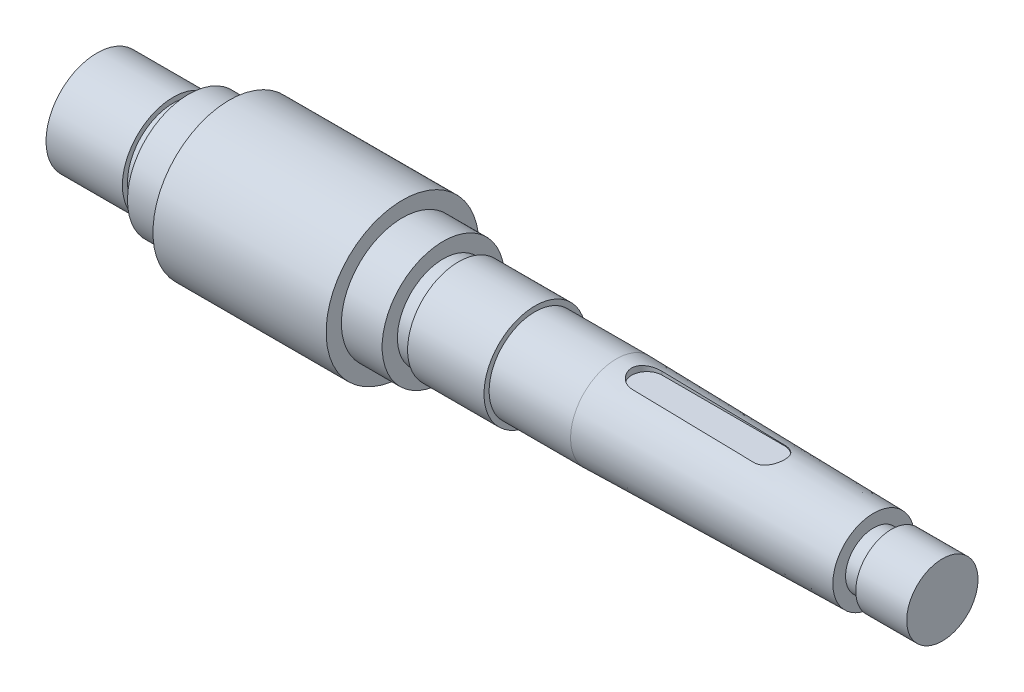
ISO-10303-21;
HEADER;
FILE_DESCRIPTION(('STEP AP214'),'2;1');
FILE_NAME('part.step','',(''),(''),'','','');
FILE_SCHEMA(('AUTOMOTIVE_DESIGN { 1 0 10303 214 1 1 1 1 }'));
ENDSEC;
DATA;
#1=APPLICATION_CONTEXT('core data for automotive mechanical design processes');
#2=APPLICATION_PROTOCOL_DEFINITION('international standard','automotive_design',2000,#1);
#3=PRODUCT_CONTEXT('',#1,'mechanical');
#4=PRODUCT('Part','Part','',(#3));
#5=PRODUCT_RELATED_PRODUCT_CATEGORY('part','',(#4));
#6=PRODUCT_DEFINITION_FORMATION('','',#4);
#7=PRODUCT_DEFINITION_CONTEXT('part definition',#1,'design');
#8=PRODUCT_DEFINITION('design','',#6,#7);
#9=PRODUCT_DEFINITION_SHAPE('','',#8);
#10=(LENGTH_UNIT() NAMED_UNIT(*) SI_UNIT(.MILLI.,.METRE.));
#11=(NAMED_UNIT(*) PLANE_ANGLE_UNIT() SI_UNIT($,.RADIAN.));
#12=(NAMED_UNIT(*) SI_UNIT($,.STERADIAN.) SOLID_ANGLE_UNIT());
#13=UNCERTAINTY_MEASURE_WITH_UNIT(LENGTH_MEASURE(1.E-05),#10,'distance_accuracy_value','');
#14=(GEOMETRIC_REPRESENTATION_CONTEXT(3) GLOBAL_UNCERTAINTY_ASSIGNED_CONTEXT((#13)) GLOBAL_UNIT_ASSIGNED_CONTEXT((#10,
#11,#12)) REPRESENTATION_CONTEXT('',''));
#15=CARTESIAN_POINT('',(0.,0.,0.));
#16=DIRECTION('',(0.,0.,1.));
#17=DIRECTION('',(1.,0.,0.));
#18=AXIS2_PLACEMENT_3D('',#15,#16,#17);
#19=CARTESIAN_POINT('',(126.5,0.,0.));
#20=DIRECTION('',(-1.,0.,0.));
#21=DIRECTION('',(0.,0.,1.));
#22=AXIS2_PLACEMENT_3D('',#19,#20,#21);
#23=CONICAL_SURFACE('',#22,8.,0.0197993925663929);
#24=CARTESIAN_POINT('',(126.5,0.,0.));
#25=DIRECTION('',(-1.,0.,0.));
#26=DIRECTION('',(0.,0.,1.));
#27=AXIS2_PLACEMENT_3D('',#24,#25,#26);
#28=CIRCLE('',#27,8.);
#29=CARTESIAN_POINT('',(126.5,0.,8.));
#30=VERTEX_POINT('',#29);
#31=EDGE_CURVE('E122',#30,#30,#28,.T.);
#32=ORIENTED_EDGE('',*,*,#31,.T.);
#33=EDGE_LOOP('',(#32));
#34=FACE_BOUND('',#33,.T.);
#35=CARTESIAN_POINT('',(76.,0.,0.));
#36=DIRECTION('',(-1.,0.,0.));
#37=DIRECTION('',(0.,0.,1.));
#38=AXIS2_PLACEMENT_3D('',#35,#36,#37);
#39=CIRCLE('',#38,9.);
#40=CARTESIAN_POINT('',(76.,0.,9.));
#41=VERTEX_POINT('',#40);
#42=EDGE_CURVE('E274',#41,#41,#39,.F.);
#43=ORIENTED_EDGE('',*,*,#42,.T.);
#44=EDGE_LOOP('',(#43));
#45=FACE_BOUND('',#44,.T.);
#46=CARTESIAN_POINT('',(67.7015994342157,8.65937921413413,3.));
#47=CARTESIAN_POINT('',(73.4673603703516,8.5385461918654,3.));
#48=CARTESIAN_POINT('',(79.2331157162742,8.41744616881826,3.));
#49=CARTESIAN_POINT('',(90.7646134080573,8.17462874625763,3.));
#50=CARTESIAN_POINT('',(96.5303557539178,8.05291134674398,3.));
#51=CARTESIAN_POINT('',(109.523755243157,7.77782492921634,3.));
#52=CARTESIAN_POINT('',(116.751408151723,7.62425570670148,3.));
#53=CARTESIAN_POINT('',(131.206685618363,7.31578576733722,3.));
#54=CARTESIAN_POINT('',(138.434310176438,7.16088505047489,3.));
#55=CARTESIAN_POINT('',(145.661917960017,7.00520342091647,3.));
#56=B_SPLINE_CURVE_WITH_KNOTS('',3,(#46,#47,#48,#49,#50,#51,#52,#53,#54,#55),.UNSPECIFIED.,.F.,
.F.,(4,2,2,2,4),(0.,17.3010808365711,34.602161677497,56.2900141665268,77.9778668659613),.UNSPECIFIED.);
#57=CARTESIAN_POINT('',(106.,7.85237780999207,3.));
#58=VERTEX_POINT('',#57);
#59=CARTESIAN_POINT('',(82.,8.35915679968532,3.));
#60=VERTEX_POINT('',#59);
#61=EDGE_CURVE('E54',#58,#60,#56,.F.);
#62=ORIENTED_EDGE('',*,*,#61,.T.);
#63=CARTESIAN_POINT('',(82.0002,8.35915259435408,2.99999999333333));
#64=CARTESIAN_POINT('',(81.9180010629251,8.36086666333517,3.00001626002523));
#65=CARTESIAN_POINT('',(81.8358367404009,8.36381871736624,2.99663288867854));
#66=CARTESIAN_POINT('',(81.6722030883547,8.37207695146977,2.98316436549772));
#67=CARTESIAN_POINT('',(81.5907335511899,8.37738240114728,2.97308129248595));
#68=CARTESIAN_POINT('',(81.4293121492684,8.39020704092438,2.94635192544998));
#69=CARTESIAN_POINT('',(81.3493563870221,8.39771937141306,2.92972591513926));
#70=CARTESIAN_POINT('',(81.191281307853,8.41475179480953,2.89009037605425));
#71=CARTESIAN_POINT('',(81.1131620796423,8.42427198448433,2.86708053960012));
#72=CARTESIAN_POINT('',(80.8824684104723,8.45546074167463,2.78880318812162));
#73=CARTESIAN_POINT('',(80.7332886214052,8.47978016498203,2.72424261178066));
#74=CARTESIAN_POINT('',(80.4478987202368,8.53297249706694,2.57238794763039));
#75=CARTESIAN_POINT('',(80.3116976120757,8.56184853062664,2.48507823221186));
#76=CARTESIAN_POINT('',(80.0502658066145,8.62249611221642,2.28616139442007));
#77=CARTESIAN_POINT('',(79.9256686423581,8.65433662078093,2.17374066654515));
#78=CARTESIAN_POINT('',(79.6967483932147,8.71667984176844,1.92952235130325));
#79=CARTESIAN_POINT('',(79.5924283402526,8.74718235360096,1.7977218713556));
#80=CARTESIAN_POINT('',(79.4047338163963,8.80444161091958,1.51462288571276));
#81=CARTESIAN_POINT('',(79.3218984348984,8.83109563674148,1.36294452418663));
#82=CARTESIAN_POINT('',(79.1832153293997,8.87689857584649,1.04666649723272));
#83=CARTESIAN_POINT('',(79.1273579822462,8.8960501648121,0.882071463614135));
#84=CARTESIAN_POINT('',(79.0465275927015,8.92408921356873,0.551958968165435));
#85=CARTESIAN_POINT('',(79.0203607509306,8.93337239417663,0.386767892667271));
#86=CARTESIAN_POINT('',(78.9958576750921,8.94205893598304,0.0540927250454134));
#87=CARTESIAN_POINT('',(78.9975140934187,8.9414649055698,-0.113390750024841));
#88=CARTESIAN_POINT('',(79.027894485599,8.93071000342325,-0.438249758829045));
#89=CARTESIAN_POINT('',(79.0554513137716,8.92096166717351,-0.595750228975074));
#90=CARTESIAN_POINT('',(79.1349382455924,8.89346082814856,-0.903725188969466));
#91=CARTESIAN_POINT('',(79.1868698212431,8.87570784197136,-1.05419925388643));
#92=CARTESIAN_POINT('',(79.3143404189009,8.83357603670031,-1.3464916888371));
#93=CARTESIAN_POINT('',(79.3902212556822,8.8091019937472,-1.48814673237288));
#94=CARTESIAN_POINT('',(79.5631174109765,8.75594607453424,-1.75703575826674));
#95=CARTESIAN_POINT('',(79.6601387465981,8.72726300104079,-1.88426561915445));
#96=CARTESIAN_POINT('',(79.8785370235662,8.66674650554063,-2.12779811043173));
#97=CARTESIAN_POINT('',(80.000927994942,8.63482672186687,-2.24317161457318));
#98=CARTESIAN_POINT('',(80.2634853029622,8.57243706386973,-2.45208045712654));
#99=CARTESIAN_POINT('',(80.4036586007138,8.54196776381447,-2.54560720240043));
#100=CARTESIAN_POINT('',(80.7016413480997,8.48509558879324,-2.70993474337041));
#101=CARTESIAN_POINT('',(80.8597583016305,8.45879107373031,-2.78021940244894));
#102=CARTESIAN_POINT('',(81.1046795261207,8.42530322652891,-2.86459142938878));
#103=CARTESIAN_POINT('',(81.1875929686086,8.41513691613645,-2.88920336612363));
#104=CARTESIAN_POINT('',(81.3554576322465,8.39707441275539,-2.93121744864749));
#105=CARTESIAN_POINT('',(81.4404078853518,8.38917716363521,-2.94862295033128));
#106=CARTESIAN_POINT('',(81.6043310777109,8.37646700294274,-2.97484998648597));
#107=CARTESIAN_POINT('',(81.6831916401469,8.37144762063953,-2.98427979932584));
#108=CARTESIAN_POINT('',(81.8414235558383,8.36362045360017,-2.99685799089608));
#109=CARTESIAN_POINT('',(81.9207941722847,8.36080998986454,-3.00001398570819));
#110=CARTESIAN_POINT('',(82.0002,8.35915259435408,-2.99999999333333));
#111=B_SPLINE_CURVE_WITH_KNOTS('',3,(#63,#64,#65,#66,#67,#68,#69,#70,#71,#72,#73,#74,#75,#76,
#77,#78,#79,#80,#81,#82,#83,#84,#85,#86,#87,#88,#89,#90,#91,#92,#93,#94,#95,#96,#97,#98,#99,
#100,#101,#102,#103,#104,#105,#106,#107,#108,#109,#110),.UNSPECIFIED.,.F.,.F.,(4,2,2,2,2,2,2,2,
2,2,2,2,2,2,2,2,2,2,2,2,2,2,2,4),(0.,0.246556907549839,0.493037347693312,0.73875961988586,
0.984493737157209,1.47515005252423,1.96614431889542,2.47625381254831,2.98643952149451,
3.5084022076923,4.03017857033914,4.53013608951832,5.02996158128682,5.50829130580088,
5.98664992058839,6.47217063140059,6.9578297143428,7.46908117468059,7.98053339176836,
8.5026809289621,8.76364687679708,9.02449116087437,9.26295933830211,9.50113785082011),.UNSPECIFIED.);
#112=CARTESIAN_POINT('',(82.,8.35915679968532,-3.));
#113=VERTEX_POINT('',#112);
#114=EDGE_CURVE('E12',#60,#113,#111,.T.);
#115=ORIENTED_EDGE('',*,*,#114,.T.);
#116=CARTESIAN_POINT('',(67.7015994342157,8.65937921413413,-3.));
#117=CARTESIAN_POINT('',(73.4673603703516,8.5385461918654,-3.));
#118=CARTESIAN_POINT('',(79.2331157162742,8.41744616881826,-3.));
#119=CARTESIAN_POINT('',(90.7646134080573,8.17462874625763,-3.));
#120=CARTESIAN_POINT('',(96.5303557539178,8.05291134674398,-3.));
#121=CARTESIAN_POINT('',(109.523755243157,7.77782492921634,-3.));
#122=CARTESIAN_POINT('',(116.751408151723,7.62425570670148,-3.));
#123=CARTESIAN_POINT('',(131.206685618363,7.31578576733722,-3.));
#124=CARTESIAN_POINT('',(138.434310176438,7.16088505047489,-3.));
#125=CARTESIAN_POINT('',(145.661917960017,7.00520342091647,-3.));
#126=B_SPLINE_CURVE_WITH_KNOTS('',3,(#116,#117,#118,#119,#120,#121,#122,#123,#124,#125),
.UNSPECIFIED.,.F.,.F.,(4,2,2,2,4),(0.,17.3010808365711,34.602161677497,56.2900141665268,
77.9778668659613),.UNSPECIFIED.);
#127=CARTESIAN_POINT('',(106.,7.85237780999207,-3.));
#128=VERTEX_POINT('',#127);
#129=EDGE_CURVE('E150',#113,#128,#126,.T.);
#130=ORIENTED_EDGE('',*,*,#129,.T.);
#131=CARTESIAN_POINT('',(105.9998,7.85238205212782,-2.99999999333333));
#132=CARTESIAN_POINT('',(106.080844146873,7.85064785022641,-3.00001660104172));
#133=CARTESIAN_POINT('',(106.161909396734,7.85019579935484,-2.99672695393381));
#134=CARTESIAN_POINT('',(106.323463607475,7.85177410222988,-2.98360857649804));
#135=CARTESIAN_POINT('',(106.403952716649,7.85380379225642,-2.97378159484397));
#136=CARTESIAN_POINT('',(106.563524847043,7.86025252300705,-2.94770362577046));
#137=CARTESIAN_POINT('',(106.642611538608,7.86466391031188,-2.93147325991976));
#138=CARTESIAN_POINT('',(106.799059532107,7.87568838346791,-2.89275068189856));
#139=CARTESIAN_POINT('',(106.876420778343,7.88230154028424,-2.87025826790008));
#140=CARTESIAN_POINT('',(107.105028938264,7.9051018796172,-2.79368386651549));
#141=CARTESIAN_POINT('',(107.25303469297,7.92426049597083,-2.73046595645925));
#142=CARTESIAN_POINT('',(107.536428375622,7.96807199890946,-2.58168011398751));
#143=CARTESIAN_POINT('',(107.671807807783,7.99272854755854,-2.49609727817249));
#144=CARTESIAN_POINT('',(107.931752174663,8.04568632721351,-2.30123424408922));
#145=CARTESIAN_POINT('',(108.055721705055,8.07408951627425,-2.19118617146046));
#146=CARTESIAN_POINT('',(108.283948040749,8.13054071811956,-1.95215384652748));
#147=CARTESIAN_POINT('',(108.388200575241,8.15858865272933,-1.82316550237987));
#148=CARTESIAN_POINT('',(108.577507519729,8.21214777698072,-1.54458951298554));
#149=CARTESIAN_POINT('',(108.661786426086,8.23753991318065,-1.39444959025394));
#150=CARTESIAN_POINT('',(108.803686113936,8.28164430900581,-1.08115335174848));
#151=CARTESIAN_POINT('',(108.861314846009,8.30035856047177,-0.918000935060528));
#152=CARTESIAN_POINT('',(108.946347728845,8.32837190806333,-0.589012099729737));
#153=CARTESIAN_POINT('',(108.974689487891,8.33796223929242,-0.423443432946697));
#154=CARTESIAN_POINT('',(109.003332527059,8.3476555255758,-0.089638234500673));
#155=CARTESIAN_POINT('',(109.0036410148,8.34776091929756,0.0785976002819341));
#156=CARTESIAN_POINT('',(108.97680731394,8.33867816449307,0.405433460157598));
#157=CARTESIAN_POINT('',(108.950819590056,8.32988086317673,0.564141079203442));
#158=CARTESIAN_POINT('',(108.874082554571,8.30453584250817,0.874787343741922));
#159=CARTESIAN_POINT('',(108.823331958614,8.28798772115194,1.02672563768908));
#160=CARTESIAN_POINT('',(108.697952720223,8.24862986934125,1.32176740948554));
#161=CARTESIAN_POINT('',(108.623035338078,8.22574492158511,1.46473771980447));
#162=CARTESIAN_POINT('',(108.451669625417,8.17618339240896,1.73641356445423));
#163=CARTESIAN_POINT('',(108.355214862909,8.14950567917193,1.86511482021049));
#164=CARTESIAN_POINT('',(108.137941029563,8.09377208965644,2.11126674894156));
#165=CARTESIAN_POINT('',(108.016160829351,8.06466371877731,2.22785894451191));
#166=CARTESIAN_POINT('',(107.754493885874,8.0086742942257,2.43927754755538));
#167=CARTESIAN_POINT('',(107.61460196777,7.98179388073423,2.5340977128159));
#168=CARTESIAN_POINT('',(107.318006071985,7.93330367666108,2.70038538943547));
#169=CARTESIAN_POINT('',(107.161101099851,7.91176972095118,2.77152129889273));
#170=CARTESIAN_POINT('',(106.917996140474,7.88610982550841,2.8573935785132));
#171=CARTESIAN_POINT('',(106.835683497861,7.8786640177383,2.88254341588021));
#172=CARTESIAN_POINT('',(106.669036090284,7.86625738377181,2.92571096669212));
#173=CARTESIAN_POINT('',(106.584702236768,7.86129545878833,2.94373183301538));
#174=CARTESIAN_POINT('',(106.417162603295,7.85418767769394,2.9720329714948));
#175=CARTESIAN_POINT('',(106.333995407583,7.85196407817039,2.9825232283794));
#176=CARTESIAN_POINT('',(106.167144803861,7.85016703530132,2.99651168149969));
#177=CARTESIAN_POINT('',(106.08346210764,7.85059051676274,3.00001798495773));
#178=CARTESIAN_POINT('',(105.9998,7.85238205212782,2.99999999333333));
#179=B_SPLINE_CURVE_WITH_KNOTS('',3,(#131,#132,#133,#134,#135,#136,#137,#138,#139,#140,#141,
#142,#143,#144,#145,#146,#147,#148,#149,#150,#151,#152,#153,#154,#155,#156,#157,#158,#159,#160,
#161,#162,#163,#164,#165,#166,#167,#168,#169,#170,#171,#172,#173,#174,#175,#176,#177,#178),
.UNSPECIFIED.,.F.,.F.,(4,2,2,2,2,2,2,2,2,2,2,2,2,2,2,2,2,2,2,2,2,2,2,4),(0.,0.243100269928748,
0.486135539018406,0.728394439447624,0.970661148869025,1.45449005453391,1.9386421968898,
2.4409381130939,2.94334270506123,3.46287206893238,3.98224634081033,4.48442316356891,
4.98647087152969,5.46739448965398,5.94834305412399,6.43526506308989,6.9223326829384,
7.43322959903987,7.94427281091863,8.46219656729538,8.72107679051577,8.97984239231336,
9.23107815917828,9.48202211223365),.UNSPECIFIED.);
#180=EDGE_CURVE('E158',#128,#58,#179,.T.);
#181=ORIENTED_EDGE('',*,*,#180,.T.);
#182=EDGE_LOOP('',(#62,#115,#130,#181));
#183=FACE_BOUND('',#182,.T.);
#184=ADVANCED_FACE('F40',(#34,#45,#183),#23,.T.);
#185=CARTESIAN_POINT('',(126.5,0.,0.));
#186=DIRECTION('',(-1.,0.,0.));
#187=DIRECTION('',(0.,0.,1.));
#188=AXIS2_PLACEMENT_3D('',#185,#186,#187);
#189=PLANE('',#188);
#190=ORIENTED_EDGE('',*,*,#31,.F.);
#191=EDGE_LOOP('',(#190));
#192=FACE_BOUND('',#191,.T.);
#193=CARTESIAN_POINT('',(126.5,0.,0.));
#194=DIRECTION('',(-1.,0.,0.));
#195=DIRECTION('',(0.,0.,1.));
#196=AXIS2_PLACEMENT_3D('',#193,#194,#195);
#197=CIRCLE('',#196,5.5);
#198=CARTESIAN_POINT('',(126.5,0.,5.5));
#199=VERTEX_POINT('',#198);
#200=EDGE_CURVE('E266',#199,#199,#197,.F.);
#201=ORIENTED_EDGE('',*,*,#200,.F.);
#202=EDGE_LOOP('',(#201));
#203=FACE_BOUND('',#202,.T.);
#204=ADVANCED_FACE('F140',(#192,#203),#189,.F.);
#205=CARTESIAN_POINT('',(-8.,0.,0.));
#206=DIRECTION('',(-1.,0.,0.));
#207=DIRECTION('',(0.,0.,1.));
#208=AXIS2_PLACEMENT_3D('',#205,#206,#207);
#209=PLANE('',#208);
#210=CARTESIAN_POINT('',(-8.,0.,0.));
#211=DIRECTION('',(-1.,0.,0.));
#212=DIRECTION('',(0.,0.,1.));
#213=AXIS2_PLACEMENT_3D('',#210,#211,#212);
#214=CIRCLE('',#213,12.);
#215=CARTESIAN_POINT('',(-8.,0.,12.));
#216=VERTEX_POINT('',#215);
#217=EDGE_CURVE('E286',#216,#216,#214,.T.);
#218=ORIENTED_EDGE('',*,*,#217,.T.);
#219=EDGE_LOOP('',(#218));
#220=FACE_BOUND('',#219,.T.);
#221=CARTESIAN_POINT('',(-8.,0.,0.));
#222=DIRECTION('',(-1.,0.,0.));
#223=DIRECTION('',(0.,0.,1.));
#224=AXIS2_PLACEMENT_3D('',#221,#222,#223);
#225=CIRCLE('',#224,9.);
#226=CARTESIAN_POINT('',(-8.,0.,9.));
#227=VERTEX_POINT('',#226);
#228=EDGE_CURVE('E546',#227,#227,#225,.T.);
#229=ORIENTED_EDGE('',*,*,#228,.F.);
#230=EDGE_LOOP('',(#229));
#231=FACE_BOUND('',#230,.T.);
#232=ADVANCED_FACE('F215',(#220,#231),#209,.T.);
#233=CARTESIAN_POINT('',(0.,0.,0.));
#234=DIRECTION('',(1.,0.,0.));
#235=DIRECTION('',(0.,0.,-1.));
#236=AXIS2_PLACEMENT_3D('',#233,#234,#235);
#237=PLANE('',#236);
#238=CARTESIAN_POINT('',(0.,0.,0.));
#239=DIRECTION('',(1.,0.,0.));
#240=DIRECTION('',(0.,0.,-1.));
#241=AXIS2_PLACEMENT_3D('',#238,#239,#240);
#242=CIRCLE('',#241,15.);
#243=CARTESIAN_POINT('',(0.,0.,-15.));
#244=VERTEX_POINT('',#243);
#245=EDGE_CURVE('E261',#244,#244,#242,.T.);
#246=ORIENTED_EDGE('',*,*,#245,.F.);
#247=EDGE_LOOP('',(#246));
#248=FACE_BOUND('',#247,.T.);
#249=CARTESIAN_POINT('',(0.,0.,0.));
#250=DIRECTION('',(1.,0.,0.));
#251=DIRECTION('',(0.,0.,-1.));
#252=AXIS2_PLACEMENT_3D('',#249,#250,#251);
#253=CIRCLE('',#252,12.);
#254=CARTESIAN_POINT('',(0.,0.,-12.));
#255=VERTEX_POINT('',#254);
#256=EDGE_CURVE('E264',#255,#255,#253,.F.);
#257=ORIENTED_EDGE('',*,*,#256,.F.);
#258=EDGE_LOOP('',(#257));
#259=FACE_BOUND('',#258,.T.);
#260=ADVANCED_FACE('F218',(#248,#259),#237,.F.);
#261=CARTESIAN_POINT('',(60.,0.,0.));
#262=DIRECTION('',(1.,0.,0.));
#263=DIRECTION('',(0.,0.,-1.));
#264=AXIS2_PLACEMENT_3D('',#261,#262,#263);
#265=PLANE('',#264);
#266=CARTESIAN_POINT('',(60.,0.,0.));
#267=DIRECTION('',(1.,0.,0.));
#268=DIRECTION('',(0.,0.,-1.));
#269=AXIS2_PLACEMENT_3D('',#266,#267,#268);
#270=CIRCLE('',#269,10.);
#271=CARTESIAN_POINT('',(60.,0.,-10.));
#272=VERTEX_POINT('',#271);
#273=EDGE_CURVE('E283',#272,#272,#270,.T.);
#274=ORIENTED_EDGE('',*,*,#273,.T.);
#275=EDGE_LOOP('',(#274));
#276=FACE_BOUND('',#275,.T.);
#277=CARTESIAN_POINT('',(60.,0.,0.));
#278=DIRECTION('',(1.,0.,0.));
#279=DIRECTION('',(0.,0.,-1.));
#280=AXIS2_PLACEMENT_3D('',#277,#278,#279);
#281=CIRCLE('',#280,9.);
#282=CARTESIAN_POINT('',(60.,0.,-9.));
#283=VERTEX_POINT('',#282);
#284=EDGE_CURVE('E278',#283,#283,#281,.T.);
#285=ORIENTED_EDGE('',*,*,#284,.F.);
#286=EDGE_LOOP('',(#285));
#287=FACE_BOUND('',#286,.T.);
#288=ADVANCED_FACE('F228',(#276,#287),#265,.T.);
#289=CARTESIAN_POINT('',(42.,0.,0.));
#290=DIRECTION('',(1.,0.,0.));
#291=DIRECTION('',(0.,0.,-1.));
#292=AXIS2_PLACEMENT_3D('',#289,#290,#291);
#293=PLANE('',#292);
#294=CARTESIAN_POINT('',(42.,0.,0.));
#295=DIRECTION('',(1.,0.,0.));
#296=DIRECTION('',(0.,0.,-1.));
#297=AXIS2_PLACEMENT_3D('',#294,#295,#296);
#298=CIRCLE('',#297,12.);
#299=CARTESIAN_POINT('',(42.,0.,-12.));
#300=VERTEX_POINT('',#299);
#301=EDGE_CURVE('E304',#300,#300,#298,.T.);
#302=ORIENTED_EDGE('',*,*,#301,.T.);
#303=EDGE_LOOP('',(#302));
#304=FACE_BOUND('',#303,.T.);
#305=CARTESIAN_POINT('',(42.,0.,0.));
#306=DIRECTION('',(1.,0.,0.));
#307=DIRECTION('',(0.,0.,-1.));
#308=AXIS2_PLACEMENT_3D('',#305,#306,#307);
#309=CIRCLE('',#308,9.);
#310=CARTESIAN_POINT('',(42.,0.,-9.));
#311=VERTEX_POINT('',#310);
#312=EDGE_CURVE('E296',#311,#311,#309,.T.);
#313=ORIENTED_EDGE('',*,*,#312,.F.);
#314=EDGE_LOOP('',(#313));
#315=FACE_BOUND('',#314,.T.);
#316=ADVANCED_FACE('F231',(#304,#315),#293,.T.);
#317=CARTESIAN_POINT('',(34.,0.,0.));
#318=DIRECTION('',(1.,0.,0.));
#319=DIRECTION('',(0.,0.,-1.));
#320=AXIS2_PLACEMENT_3D('',#317,#318,#319);
#321=PLANE('',#320);
#322=CARTESIAN_POINT('',(34.,0.,0.));
#323=DIRECTION('',(1.,0.,0.));
#324=DIRECTION('',(0.,0.,-1.));
#325=AXIS2_PLACEMENT_3D('',#322,#323,#324);
#326=CIRCLE('',#325,15.);
#327=CARTESIAN_POINT('',(34.,0.,-15.));
#328=VERTEX_POINT('',#327);
#329=EDGE_CURVE('E267',#328,#328,#326,.T.);
#330=ORIENTED_EDGE('',*,*,#329,.T.);
#331=EDGE_LOOP('',(#330));
#332=FACE_BOUND('',#331,.T.);
#333=CARTESIAN_POINT('',(34.,0.,0.));
#334=DIRECTION('',(1.,0.,0.));
#335=DIRECTION('',(0.,0.,-1.));
#336=AXIS2_PLACEMENT_3D('',#333,#334,#335);
#337=CIRCLE('',#336,12.);
#338=CARTESIAN_POINT('',(34.,0.,-12.));
#339=VERTEX_POINT('',#338);
#340=EDGE_CURVE('E301',#339,#339,#337,.T.);
#341=ORIENTED_EDGE('',*,*,#340,.F.);
#342=EDGE_LOOP('',(#341));
#343=FACE_BOUND('',#342,.T.);
#344=ADVANCED_FACE('F247',(#332,#343),#321,.T.);
#345=CARTESIAN_POINT('',(34.,0.,0.));
#346=DIRECTION('',(-1.,0.,0.));
#347=DIRECTION('',(0.,0.,1.));
#348=AXIS2_PLACEMENT_3D('',#345,#346,#347);
#349=CYLINDRICAL_SURFACE('',#348,15.);
#350=ORIENTED_EDGE('',*,*,#329,.F.);
#351=EDGE_LOOP('',(#350));
#352=FACE_BOUND('',#351,.T.);
#353=ORIENTED_EDGE('',*,*,#245,.T.);
#354=EDGE_LOOP('',(#353));
#355=FACE_BOUND('',#354,.T.);
#356=ADVANCED_FACE('F42',(#352,#355),#349,.T.);
#357=CARTESIAN_POINT('',(42.,0.,0.));
#358=DIRECTION('',(-1.,0.,0.));
#359=DIRECTION('',(0.,0.,1.));
#360=AXIS2_PLACEMENT_3D('',#357,#358,#359);
#361=CYLINDRICAL_SURFACE('',#360,12.);
#362=ORIENTED_EDGE('',*,*,#301,.F.);
#363=EDGE_LOOP('',(#362));
#364=FACE_BOUND('',#363,.T.);
#365=ORIENTED_EDGE('',*,*,#340,.T.);
#366=EDGE_LOOP('',(#365));
#367=FACE_BOUND('',#366,.T.);
#368=ADVANCED_FACE('F243',(#364,#367),#361,.T.);
#369=CARTESIAN_POINT('',(45.,0.,0.));
#370=DIRECTION('',(-1.,0.,0.));
#371=DIRECTION('',(0.,0.,1.));
#372=AXIS2_PLACEMENT_3D('',#369,#370,#371);
#373=CYLINDRICAL_SURFACE('',#372,9.);
#374=CARTESIAN_POINT('',(45.,0.,0.));
#375=DIRECTION('',(1.,0.,0.));
#376=DIRECTION('',(0.,0.,-1.));
#377=AXIS2_PLACEMENT_3D('',#374,#375,#376);
#378=CIRCLE('',#377,9.);
#379=CARTESIAN_POINT('',(45.,0.,-9.));
#380=VERTEX_POINT('',#379);
#381=EDGE_CURVE('E298',#380,#380,#378,.T.);
#382=ORIENTED_EDGE('',*,*,#381,.F.);
#383=EDGE_LOOP('',(#382));
#384=FACE_BOUND('',#383,.T.);
#385=ORIENTED_EDGE('',*,*,#312,.T.);
#386=EDGE_LOOP('',(#385));
#387=FACE_BOUND('',#386,.T.);
#388=ADVANCED_FACE('F236',(#384,#387),#373,.T.);
#389=CARTESIAN_POINT('',(45.,0.,0.));
#390=DIRECTION('',(1.,0.,0.));
#391=DIRECTION('',(0.,0.,-1.));
#392=AXIS2_PLACEMENT_3D('',#389,#390,#391);
#393=PLANE('',#392);
#394=CARTESIAN_POINT('',(45.,0.,0.));
#395=DIRECTION('',(1.,0.,0.));
#396=DIRECTION('',(0.,0.,-1.));
#397=AXIS2_PLACEMENT_3D('',#394,#395,#396);
#398=CIRCLE('',#397,10.);
#399=CARTESIAN_POINT('',(45.,0.,-10.));
#400=VERTEX_POINT('',#399);
#401=EDGE_CURVE('E277',#400,#400,#398,.T.);
#402=ORIENTED_EDGE('',*,*,#401,.F.);
#403=EDGE_LOOP('',(#402));
#404=FACE_BOUND('',#403,.T.);
#405=ORIENTED_EDGE('',*,*,#381,.T.);
#406=EDGE_LOOP('',(#405));
#407=FACE_BOUND('',#406,.T.);
#408=ADVANCED_FACE('F233',(#404,#407),#393,.F.);
#409=CARTESIAN_POINT('',(60.,0.,0.));
#410=DIRECTION('',(-1.,0.,0.));
#411=DIRECTION('',(0.,0.,1.));
#412=AXIS2_PLACEMENT_3D('',#409,#410,#411);
#413=CYLINDRICAL_SURFACE('',#412,10.);
#414=ORIENTED_EDGE('',*,*,#273,.F.);
#415=EDGE_LOOP('',(#414));
#416=FACE_BOUND('',#415,.T.);
#417=ORIENTED_EDGE('',*,*,#401,.T.);
#418=EDGE_LOOP('',(#417));
#419=FACE_BOUND('',#418,.T.);
#420=ADVANCED_FACE('F226',(#416,#419),#413,.T.);
#421=CARTESIAN_POINT('',(76.,0.,0.));
#422=DIRECTION('',(-1.,0.,0.));
#423=DIRECTION('',(0.,0.,1.));
#424=AXIS2_PLACEMENT_3D('',#421,#422,#423);
#425=CYLINDRICAL_SURFACE('',#424,9.);
#426=ORIENTED_EDGE('',*,*,#42,.F.);
#427=EDGE_LOOP('',(#426));
#428=FACE_BOUND('',#427,.T.);
#429=ORIENTED_EDGE('',*,*,#284,.T.);
#430=EDGE_LOOP('',(#429));
#431=FACE_BOUND('',#430,.T.);
#432=ADVANCED_FACE('F222',(#428,#431),#425,.T.);
#433=CARTESIAN_POINT('',(-8.,0.,0.));
#434=DIRECTION('',(1.,0.,0.));
#435=DIRECTION('',(0.,0.,-1.));
#436=AXIS2_PLACEMENT_3D('',#433,#434,#435);
#437=CYLINDRICAL_SURFACE('',#436,12.);
#438=ORIENTED_EDGE('',*,*,#217,.F.);
#439=EDGE_LOOP('',(#438));
#440=FACE_BOUND('',#439,.T.);
#441=ORIENTED_EDGE('',*,*,#256,.T.);
#442=EDGE_LOOP('',(#441));
#443=FACE_BOUND('',#442,.T.);
#444=ADVANCED_FACE('F213',(#440,#443),#437,.T.);
#445=CARTESIAN_POINT('',(-11.,0.,0.));
#446=DIRECTION('',(1.,0.,0.));
#447=DIRECTION('',(0.,0.,-1.));
#448=AXIS2_PLACEMENT_3D('',#445,#446,#447);
#449=CYLINDRICAL_SURFACE('',#448,9.);
#450=CARTESIAN_POINT('',(-11.,0.,0.));
#451=DIRECTION('',(-1.,0.,0.));
#452=DIRECTION('',(0.,0.,1.));
#453=AXIS2_PLACEMENT_3D('',#450,#451,#452);
#454=CIRCLE('',#453,9.);
#455=CARTESIAN_POINT('',(-11.,0.,9.));
#456=VERTEX_POINT('',#455);
#457=EDGE_CURVE('E291',#456,#456,#454,.T.);
#458=ORIENTED_EDGE('',*,*,#457,.F.);
#459=EDGE_LOOP('',(#458));
#460=FACE_BOUND('',#459,.T.);
#461=ORIENTED_EDGE('',*,*,#228,.T.);
#462=EDGE_LOOP('',(#461));
#463=FACE_BOUND('',#462,.T.);
#464=ADVANCED_FACE('F208',(#460,#463),#449,.T.);
#465=CARTESIAN_POINT('',(-11.,0.,0.));
#466=DIRECTION('',(-1.,0.,0.));
#467=DIRECTION('',(0.,0.,1.));
#468=AXIS2_PLACEMENT_3D('',#465,#466,#467);
#469=PLANE('',#468);
#470=CARTESIAN_POINT('',(-11.,0.,0.));
#471=DIRECTION('',(-1.,0.,0.));
#472=DIRECTION('',(0.,0.,1.));
#473=AXIS2_PLACEMENT_3D('',#470,#471,#472);
#474=CIRCLE('',#473,10.);
#475=CARTESIAN_POINT('',(-11.,0.,10.));
#476=VERTEX_POINT('',#475);
#477=EDGE_CURVE('E536',#476,#476,#474,.T.);
#478=ORIENTED_EDGE('',*,*,#477,.F.);
#479=EDGE_LOOP('',(#478));
#480=FACE_BOUND('',#479,.T.);
#481=ORIENTED_EDGE('',*,*,#457,.T.);
#482=EDGE_LOOP('',(#481));
#483=FACE_BOUND('',#482,.T.);
#484=ADVANCED_FACE('F202',(#480,#483),#469,.F.);
#485=CARTESIAN_POINT('',(-26.,0.,0.));
#486=DIRECTION('',(1.,0.,0.));
#487=DIRECTION('',(0.,0.,-1.));
#488=AXIS2_PLACEMENT_3D('',#485,#486,#487);
#489=CYLINDRICAL_SURFACE('',#488,10.);
#490=CARTESIAN_POINT('',(-26.,0.,0.));
#491=DIRECTION('',(-1.,0.,0.));
#492=DIRECTION('',(0.,0.,1.));
#493=AXIS2_PLACEMENT_3D('',#490,#491,#492);
#494=CIRCLE('',#493,10.);
#495=CARTESIAN_POINT('',(-26.,0.,10.));
#496=VERTEX_POINT('',#495);
#497=EDGE_CURVE('E539',#496,#496,#494,.T.);
#498=ORIENTED_EDGE('',*,*,#497,.F.);
#499=EDGE_LOOP('',(#498));
#500=FACE_BOUND('',#499,.T.);
#501=ORIENTED_EDGE('',*,*,#477,.T.);
#502=EDGE_LOOP('',(#501));
#503=FACE_BOUND('',#502,.T.);
#504=ADVANCED_FACE('F192',(#500,#503),#489,.T.);
#505=CARTESIAN_POINT('',(-26.,0.,0.));
#506=DIRECTION('',(-1.,0.,0.));
#507=DIRECTION('',(0.,0.,1.));
#508=AXIS2_PLACEMENT_3D('',#505,#506,#507);
#509=PLANE('',#508);
#510=ORIENTED_EDGE('',*,*,#497,.T.);
#511=EDGE_LOOP('',(#510));
#512=FACE_BOUND('',#511,.T.);
#513=ADVANCED_FACE('F185',(#512),#509,.T.);
#514=CARTESIAN_POINT('',(130.,0.,0.));
#515=DIRECTION('',(1.,0.,0.));
#516=DIRECTION('',(0.,0.,-1.));
#517=AXIS2_PLACEMENT_3D('',#514,#515,#516);
#518=PLANE('',#517);
#519=CARTESIAN_POINT('',(130.,0.,0.));
#520=DIRECTION('',(1.,0.,0.));
#521=DIRECTION('',(0.,0.,-1.));
#522=AXIS2_PLACEMENT_3D('',#519,#520,#521);
#523=CIRCLE('',#522,7.);
#524=CARTESIAN_POINT('',(130.,0.,-7.));
#525=VERTEX_POINT('',#524);
#526=EDGE_CURVE('E91',#525,#525,#523,.T.);
#527=ORIENTED_EDGE('',*,*,#526,.F.);
#528=EDGE_LOOP('',(#527));
#529=FACE_BOUND('',#528,.T.);
#530=CARTESIAN_POINT('',(130.,0.,0.));
#531=DIRECTION('',(1.,0.,0.));
#532=DIRECTION('',(0.,0.,-1.));
#533=AXIS2_PLACEMENT_3D('',#530,#531,#532);
#534=CIRCLE('',#533,5.5);
#535=CARTESIAN_POINT('',(130.,0.,-5.5));
#536=VERTEX_POINT('',#535);
#537=EDGE_CURVE('E117',#536,#536,#534,.F.);
#538=ORIENTED_EDGE('',*,*,#537,.F.);
#539=EDGE_LOOP('',(#538));
#540=FACE_BOUND('',#539,.T.);
#541=ADVANCED_FACE('F183',(#529,#540),#518,.F.);
#542=CARTESIAN_POINT('',(140.,0.,0.));
#543=DIRECTION('',(-1.,0.,0.));
#544=DIRECTION('',(0.,0.,1.));
#545=AXIS2_PLACEMENT_3D('',#542,#543,#544);
#546=CYLINDRICAL_SURFACE('',#545,7.);
#547=CARTESIAN_POINT('',(140.,0.,0.));
#548=DIRECTION('',(1.,0.,0.));
#549=DIRECTION('',(0.,0.,-1.));
#550=AXIS2_PLACEMENT_3D('',#547,#548,#549);
#551=CIRCLE('',#550,7.);
#552=CARTESIAN_POINT('',(140.,0.,-7.));
#553=VERTEX_POINT('',#552);
#554=EDGE_CURVE('E114',#553,#553,#551,.T.);
#555=ORIENTED_EDGE('',*,*,#554,.F.);
#556=EDGE_LOOP('',(#555));
#557=FACE_BOUND('',#556,.T.);
#558=ORIENTED_EDGE('',*,*,#526,.T.);
#559=EDGE_LOOP('',(#558));
#560=FACE_BOUND('',#559,.T.);
#561=ADVANCED_FACE('F141',(#557,#560),#546,.T.);
#562=CARTESIAN_POINT('',(140.,0.,0.));
#563=DIRECTION('',(1.,0.,0.));
#564=DIRECTION('',(0.,0.,-1.));
#565=AXIS2_PLACEMENT_3D('',#562,#563,#564);
#566=PLANE('',#565);
#567=ORIENTED_EDGE('',*,*,#554,.T.);
#568=EDGE_LOOP('',(#567));
#569=FACE_BOUND('',#568,.T.);
#570=ADVANCED_FACE('F179',(#569),#566,.T.);
#571=CARTESIAN_POINT('',(126.5,0.,0.));
#572=DIRECTION('',(1.,0.,0.));
#573=DIRECTION('',(0.,0.,-1.));
#574=AXIS2_PLACEMENT_3D('',#571,#572,#573);
#575=CYLINDRICAL_SURFACE('',#574,5.5);
#576=ORIENTED_EDGE('',*,*,#200,.T.);
#577=EDGE_LOOP('',(#576));
#578=FACE_BOUND('',#577,.T.);
#579=ORIENTED_EDGE('',*,*,#537,.T.);
#580=EDGE_LOOP('',(#579));
#581=FACE_BOUND('',#580,.T.);
#582=ADVANCED_FACE('F176',(#578,#581),#575,.T.);
#583=CARTESIAN_POINT('',(82.,11.2,0.));
#584=DIRECTION('',(0.,-1.,0.));
#585=DIRECTION('',(0.,0.,-1.));
#586=AXIS2_PLACEMENT_3D('',#583,#584,#585);
#587=CYLINDRICAL_SURFACE('',#586,3.);
#588=DIRECTION('',(0.,-1.,0.));
#589=VECTOR('',#588,1.);
#590=CARTESIAN_POINT('',(82.,11.2,3.));
#591=LINE('',#590,#589);
#592=CARTESIAN_POINT('',(82.,7.7,3.));
#593=VERTEX_POINT('',#592);
#594=EDGE_CURVE('E84',#60,#593,#591,.T.);
#595=ORIENTED_EDGE('',*,*,#594,.T.);
#596=CARTESIAN_POINT('',(82.,7.7,0.));
#597=DIRECTION('',(0.,1.,0.));
#598=DIRECTION('',(0.,0.,-1.));
#599=AXIS2_PLACEMENT_3D('',#596,#597,#598);
#600=CIRCLE('',#599,3.);
#601=CARTESIAN_POINT('',(82.,7.7,-3.));
#602=VERTEX_POINT('',#601);
#603=EDGE_CURVE('E88',#602,#593,#600,.T.);
#604=ORIENTED_EDGE('',*,*,#603,.F.);
#605=DIRECTION('',(0.,-1.,0.));
#606=VECTOR('',#605,1.);
#607=CARTESIAN_POINT('',(82.,11.2,-3.));
#608=LINE('',#607,#606);
#609=EDGE_CURVE('E110',#113,#602,#608,.T.);
#610=ORIENTED_EDGE('',*,*,#609,.F.);
#611=ORIENTED_EDGE('',*,*,#114,.F.);
#612=EDGE_LOOP('',(#595,#604,#610,#611));
#613=FACE_BOUND('',#612,.T.);
#614=ADVANCED_FACE('F86',(#613),#587,.F.);
#615=CARTESIAN_POINT('',(82.,11.2,3.));
#616=DIRECTION('',(0.,0.,-1.));
#617=DIRECTION('',(-1.,0.,0.));
#618=AXIS2_PLACEMENT_3D('',#615,#616,#617);
#619=PLANE('',#618);
#620=DIRECTION('',(0.,-1.,0.));
#621=VECTOR('',#620,1.);
#622=CARTESIAN_POINT('',(106.,11.2,3.));
#623=LINE('',#622,#621);
#624=CARTESIAN_POINT('',(106.,7.7,3.));
#625=VERTEX_POINT('',#624);
#626=EDGE_CURVE('E92',#58,#625,#623,.T.);
#627=ORIENTED_EDGE('',*,*,#626,.T.);
#628=DIRECTION('',(1.,0.,0.));
#629=VECTOR('',#628,1.);
#630=CARTESIAN_POINT('',(82.,7.7,3.));
#631=LINE('',#630,#629);
#632=EDGE_CURVE('E95',#593,#625,#631,.T.);
#633=ORIENTED_EDGE('',*,*,#632,.F.);
#634=ORIENTED_EDGE('',*,*,#594,.F.);
#635=ORIENTED_EDGE('',*,*,#61,.F.);
#636=EDGE_LOOP('',(#627,#633,#634,#635));
#637=FACE_BOUND('',#636,.T.);
#638=ADVANCED_FACE('F96',(#637),#619,.T.);
#639=CARTESIAN_POINT('',(106.,11.2,0.));
#640=DIRECTION('',(0.,-1.,0.));
#641=DIRECTION('',(0.,0.,-1.));
#642=AXIS2_PLACEMENT_3D('',#639,#640,#641);
#643=CYLINDRICAL_SURFACE('',#642,3.);
#644=DIRECTION('',(0.,-1.,0.));
#645=VECTOR('',#644,1.);
#646=CARTESIAN_POINT('',(106.,11.2,-3.));
#647=LINE('',#646,#645);
#648=CARTESIAN_POINT('',(106.,7.7,-3.));
#649=VERTEX_POINT('',#648);
#650=EDGE_CURVE('E61',#128,#649,#647,.T.);
#651=ORIENTED_EDGE('',*,*,#650,.T.);
#652=CARTESIAN_POINT('',(106.,7.7,0.));
#653=DIRECTION('',(0.,1.,0.));
#654=DIRECTION('',(0.,0.,1.));
#655=AXIS2_PLACEMENT_3D('',#652,#653,#654);
#656=CIRCLE('',#655,3.);
#657=EDGE_CURVE('E101',#625,#649,#656,.T.);
#658=ORIENTED_EDGE('',*,*,#657,.F.);
#659=ORIENTED_EDGE('',*,*,#626,.F.);
#660=ORIENTED_EDGE('',*,*,#180,.F.);
#661=EDGE_LOOP('',(#651,#658,#659,#660));
#662=FACE_BOUND('',#661,.T.);
#663=ADVANCED_FACE('F171',(#662),#643,.F.);
#664=CARTESIAN_POINT('',(82.,11.2,-3.));
#665=DIRECTION('',(0.,0.,1.));
#666=DIRECTION('',(1.,0.,0.));
#667=AXIS2_PLACEMENT_3D('',#664,#665,#666);
#668=PLANE('',#667);
#669=ORIENTED_EDGE('',*,*,#609,.T.);
#670=DIRECTION('',(-1.,0.,0.));
#671=VECTOR('',#670,1.);
#672=CARTESIAN_POINT('',(82.,7.7,-3.));
#673=LINE('',#672,#671);
#674=EDGE_CURVE('E105',#649,#602,#673,.T.);
#675=ORIENTED_EDGE('',*,*,#674,.F.);
#676=ORIENTED_EDGE('',*,*,#650,.F.);
#677=ORIENTED_EDGE('',*,*,#129,.F.);
#678=EDGE_LOOP('',(#669,#675,#676,#677));
#679=FACE_BOUND('',#678,.T.);
#680=ADVANCED_FACE('F405',(#679),#668,.T.);
#681=CARTESIAN_POINT('',(82.,7.7,0.));
#682=DIRECTION('',(0.,-1.,0.));
#683=DIRECTION('',(0.,0.,-1.));
#684=AXIS2_PLACEMENT_3D('',#681,#682,#683);
#685=PLANE('',#684);
#686=ORIENTED_EDGE('',*,*,#603,.T.);
#687=ORIENTED_EDGE('',*,*,#632,.T.);
#688=ORIENTED_EDGE('',*,*,#657,.T.);
#689=ORIENTED_EDGE('',*,*,#674,.T.);
#690=EDGE_LOOP('',(#686,#687,#688,#689));
#691=FACE_BOUND('',#690,.T.);
#692=ADVANCED_FACE('F104',(#691),#685,.F.);
#693=CLOSED_SHELL('',(#184,#204,#232,#260,#288,#316,#344,#356,#368,#388,#408,#420,#432,#444,
#464,#484,#504,#513,#541,#561,#570,#582,#614,#638,#663,#680,#692));
#694=MANIFOLD_SOLID_BREP('B2',#693);
#695=ADVANCED_BREP_SHAPE_REPRESENTATION('',(#18,#694),#14);
#696=SHAPE_DEFINITION_REPRESENTATION(#9,#695);
ENDSEC;
END-ISO-10303-21;
